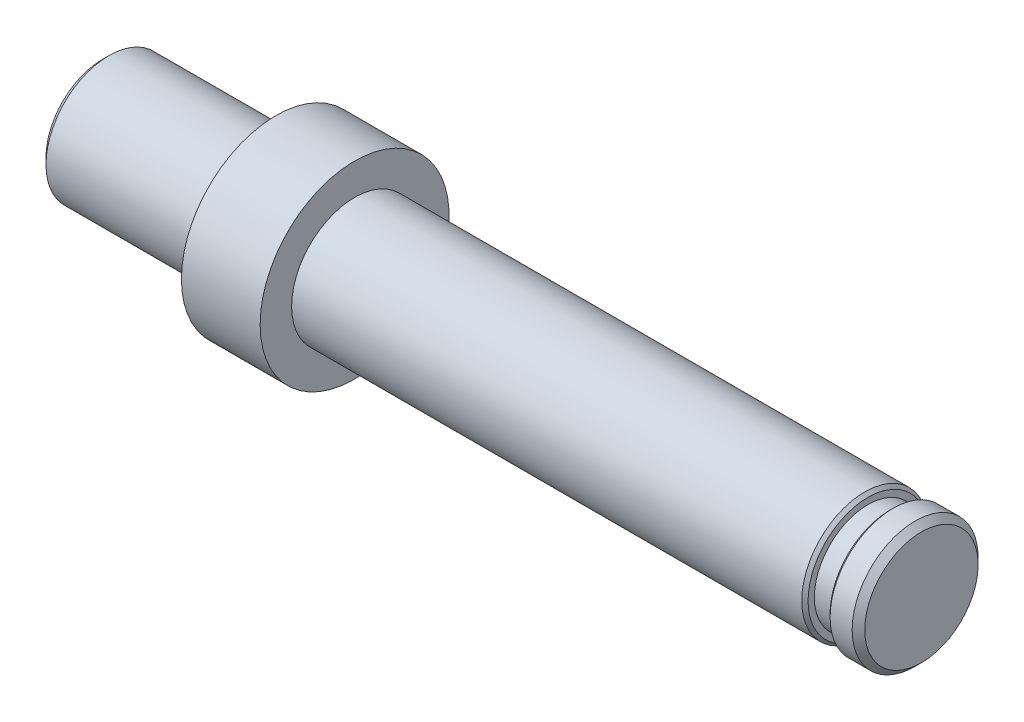
ISO-10303-21;
HEADER;
FILE_DESCRIPTION(('STEP AP214'),'2;1');
FILE_NAME('part.step','',(''),(''),'','','');
FILE_SCHEMA(('AUTOMOTIVE_DESIGN { 1 0 10303 214 1 1 1 1 }'));
ENDSEC;
DATA;
#1=APPLICATION_CONTEXT('core data for automotive mechanical design processes');
#2=APPLICATION_PROTOCOL_DEFINITION('international standard','automotive_design',2000,#1);
#3=PRODUCT_CONTEXT('',#1,'mechanical');
#4=PRODUCT('Part','Part','',(#3));
#5=PRODUCT_RELATED_PRODUCT_CATEGORY('part','',(#4));
#6=PRODUCT_DEFINITION_FORMATION('','',#4);
#7=PRODUCT_DEFINITION_CONTEXT('part definition',#1,'design');
#8=PRODUCT_DEFINITION('design','',#6,#7);
#9=PRODUCT_DEFINITION_SHAPE('','',#8);
#10=(LENGTH_UNIT() NAMED_UNIT(*) SI_UNIT(.MILLI.,.METRE.));
#11=(NAMED_UNIT(*) PLANE_ANGLE_UNIT() SI_UNIT($,.RADIAN.));
#12=(NAMED_UNIT(*) SI_UNIT($,.STERADIAN.) SOLID_ANGLE_UNIT());
#13=UNCERTAINTY_MEASURE_WITH_UNIT(LENGTH_MEASURE(1.E-05),#10,'distance_accuracy_value','');
#14=(GEOMETRIC_REPRESENTATION_CONTEXT(3) GLOBAL_UNCERTAINTY_ASSIGNED_CONTEXT((#13)) GLOBAL_UNIT_ASSIGNED_CONTEXT((#10,
#11,#12)) REPRESENTATION_CONTEXT('',''));
#15=CARTESIAN_POINT('',(0.,0.,0.));
#16=DIRECTION('',(0.,0.,1.));
#17=DIRECTION('',(1.,0.,0.));
#18=AXIS2_PLACEMENT_3D('',#15,#16,#17);
#19=CARTESIAN_POINT('',(0.,2.,0.));
#20=DIRECTION('',(1.,0.,0.));
#21=DIRECTION('',(0.,0.,-1.));
#22=AXIS2_PLACEMENT_3D('',#19,#20,#21);
#23=PLANE('',#22);
#24=CARTESIAN_POINT('',(0.,0.,0.));
#25=DIRECTION('',(1.,0.,0.));
#26=DIRECTION('',(0.,0.,-1.));
#27=AXIS2_PLACEMENT_3D('',#24,#25,#26);
#28=CIRCLE('',#27,1.8);
#29=CARTESIAN_POINT('',(0.,0.,-1.8));
#30=VERTEX_POINT('',#29);
#31=EDGE_CURVE('E69',#30,#30,#28,.F.);
#32=ORIENTED_EDGE('',*,*,#31,.T.);
#33=EDGE_LOOP('',(#32));
#34=FACE_BOUND('',#33,.T.);
#35=ADVANCED_FACE('F39',(#34),#23,.F.);
#36=CARTESIAN_POINT('',(26.,0.,0.));
#37=DIRECTION('',(-1.,0.,0.));
#38=DIRECTION('',(0.,0.,1.));
#39=AXIS2_PLACEMENT_3D('',#36,#37,#38);
#40=PLANE('',#39);
#41=CARTESIAN_POINT('',(26.,0.,0.));
#42=DIRECTION('',(-1.,0.,0.));
#43=DIRECTION('',(0.,0.,1.));
#44=AXIS2_PLACEMENT_3D('',#41,#42,#43);
#45=CIRCLE('',#44,1.8);
#46=CARTESIAN_POINT('',(26.,0.,1.8));
#47=VERTEX_POINT('',#46);
#48=EDGE_CURVE('E60',#47,#47,#45,.F.);
#49=ORIENTED_EDGE('',*,*,#48,.T.);
#50=EDGE_LOOP('',(#49));
#51=FACE_BOUND('',#50,.T.);
#52=ADVANCED_FACE('F121',(#51),#40,.F.);
#53=CARTESIAN_POINT('',(0.,0.,0.));
#54=DIRECTION('',(-1.,0.,0.));
#55=DIRECTION('',(0.,0.,1.));
#56=AXIS2_PLACEMENT_3D('',#53,#54,#55);
#57=CYLINDRICAL_SURFACE('',#56,2.);
#58=CARTESIAN_POINT('',(25.1,0.,0.));
#59=DIRECTION('',(1.,0.,0.));
#60=DIRECTION('',(0.,0.,-1.));
#61=AXIS2_PLACEMENT_3D('',#58,#59,#60);
#62=CIRCLE('',#61,2.);
#63=CARTESIAN_POINT('',(25.1,0.,-2.));
#64=VERTEX_POINT('',#63);
#65=EDGE_CURVE('E51',#64,#64,#62,.T.);
#66=ORIENTED_EDGE('',*,*,#65,.T.);
#67=EDGE_LOOP('',(#66));
#68=FACE_BOUND('',#67,.T.);
#69=CARTESIAN_POINT('',(25.8,0.,0.));
#70=DIRECTION('',(-1.,0.,0.));
#71=DIRECTION('',(0.,0.,1.));
#72=AXIS2_PLACEMENT_3D('',#69,#70,#71);
#73=CIRCLE('',#72,2.);
#74=CARTESIAN_POINT('',(25.8,0.,2.));
#75=VERTEX_POINT('',#74);
#76=EDGE_CURVE('E63',#75,#75,#73,.T.);
#77=ORIENTED_EDGE('',*,*,#76,.T.);
#78=EDGE_LOOP('',(#77));
#79=FACE_BOUND('',#78,.T.);
#80=ADVANCED_FACE('F127',(#68,#79),#57,.T.);
#81=CARTESIAN_POINT('',(25.,2.,0.));
#82=DIRECTION('',(1.,0.,0.));
#83=DIRECTION('',(0.,0.,-1.));
#84=AXIS2_PLACEMENT_3D('',#81,#82,#83);
#85=PLANE('',#84);
#86=CARTESIAN_POINT('',(25.,0.,0.));
#87=DIRECTION('',(1.,0.,0.));
#88=DIRECTION('',(0.,0.,-1.));
#89=AXIS2_PLACEMENT_3D('',#86,#87,#88);
#90=CIRCLE('',#89,1.9);
#91=CARTESIAN_POINT('',(25.,0.,-1.9));
#92=VERTEX_POINT('',#91);
#93=EDGE_CURVE('E55',#92,#92,#90,.F.);
#94=ORIENTED_EDGE('',*,*,#93,.T.);
#95=EDGE_LOOP('',(#94));
#96=FACE_BOUND('',#95,.T.);
#97=CARTESIAN_POINT('',(25.,0.,0.));
#98=DIRECTION('',(-1.,0.,0.));
#99=DIRECTION('',(0.,0.,1.));
#100=AXIS2_PLACEMENT_3D('',#97,#98,#99);
#101=CIRCLE('',#100,1.7);
#102=CARTESIAN_POINT('',(25.,0.,1.7));
#103=VERTEX_POINT('',#102);
#104=EDGE_CURVE('E72',#103,#103,#101,.T.);
#105=ORIENTED_EDGE('',*,*,#104,.F.);
#106=EDGE_LOOP('',(#105));
#107=FACE_BOUND('',#106,.T.);
#108=ADVANCED_FACE('F159',(#96,#107),#85,.F.);
#109=CARTESIAN_POINT('',(0.,0.,0.));
#110=DIRECTION('',(-1.,0.,0.));
#111=DIRECTION('',(0.,0.,1.));
#112=AXIS2_PLACEMENT_3D('',#109,#110,#111);
#113=CYLINDRICAL_SURFACE('',#112,1.7);
#114=CARTESIAN_POINT('',(24.3,0.,0.));
#115=DIRECTION('',(-1.,0.,0.));
#116=DIRECTION('',(0.,0.,1.));
#117=AXIS2_PLACEMENT_3D('',#114,#115,#116);
#118=CIRCLE('',#117,1.7);
#119=CARTESIAN_POINT('',(24.3,0.,1.7));
#120=VERTEX_POINT('',#119);
#121=EDGE_CURVE('E75',#120,#120,#118,.T.);
#122=ORIENTED_EDGE('',*,*,#121,.F.);
#123=EDGE_LOOP('',(#122));
#124=FACE_BOUND('',#123,.T.);
#125=ORIENTED_EDGE('',*,*,#104,.T.);
#126=EDGE_LOOP('',(#125));
#127=FACE_BOUND('',#126,.T.);
#128=ADVANCED_FACE('F118',(#124,#127),#113,.T.);
#129=CARTESIAN_POINT('',(24.3,1.7,0.));
#130=DIRECTION('',(-1.,0.,0.));
#131=DIRECTION('',(0.,0.,1.));
#132=AXIS2_PLACEMENT_3D('',#129,#130,#131);
#133=PLANE('',#132);
#134=CARTESIAN_POINT('',(24.3,0.,0.));
#135=DIRECTION('',(-1.,0.,0.));
#136=DIRECTION('',(0.,0.,1.));
#137=AXIS2_PLACEMENT_3D('',#134,#135,#136);
#138=CIRCLE('',#137,1.9);
#139=CARTESIAN_POINT('',(24.3,0.,1.9));
#140=VERTEX_POINT('',#139);
#141=EDGE_CURVE('E10',#140,#140,#138,.F.);
#142=ORIENTED_EDGE('',*,*,#141,.T.);
#143=EDGE_LOOP('',(#142));
#144=FACE_BOUND('',#143,.T.);
#145=ORIENTED_EDGE('',*,*,#121,.T.);
#146=EDGE_LOOP('',(#145));
#147=FACE_BOUND('',#146,.T.);
#148=ADVANCED_FACE('F113',(#144,#147),#133,.F.);
#149=CARTESIAN_POINT('',(0.,0.,0.));
#150=DIRECTION('',(-1.,0.,0.));
#151=DIRECTION('',(0.,0.,1.));
#152=AXIS2_PLACEMENT_3D('',#149,#150,#151);
#153=CYLINDRICAL_SURFACE('',#152,2.);
#154=CARTESIAN_POINT('',(24.2,0.,0.));
#155=DIRECTION('',(-1.,0.,0.));
#156=DIRECTION('',(0.,0.,1.));
#157=AXIS2_PLACEMENT_3D('',#154,#155,#156);
#158=CIRCLE('',#157,2.);
#159=CARTESIAN_POINT('',(24.2,0.,2.));
#160=VERTEX_POINT('',#159);
#161=EDGE_CURVE('E47',#160,#160,#158,.T.);
#162=ORIENTED_EDGE('',*,*,#161,.T.);
#163=EDGE_LOOP('',(#162));
#164=FACE_BOUND('',#163,.T.);
#165=CARTESIAN_POINT('',(8.,0.,0.));
#166=DIRECTION('',(-1.,0.,0.));
#167=DIRECTION('',(0.,0.,1.));
#168=AXIS2_PLACEMENT_3D('',#165,#166,#167);
#169=CIRCLE('',#168,2.);
#170=CARTESIAN_POINT('',(8.,0.,2.));
#171=VERTEX_POINT('',#170);
#172=EDGE_CURVE('E78',#171,#171,#169,.T.);
#173=ORIENTED_EDGE('',*,*,#172,.F.);
#174=EDGE_LOOP('',(#173));
#175=FACE_BOUND('',#174,.T.);
#176=ADVANCED_FACE('F108',(#164,#175),#153,.T.);
#177=CARTESIAN_POINT('',(8.,2.,0.));
#178=DIRECTION('',(-1.,0.,0.));
#179=DIRECTION('',(0.,0.,1.));
#180=AXIS2_PLACEMENT_3D('',#177,#178,#179);
#181=PLANE('',#180);
#182=CARTESIAN_POINT('',(8.,0.,0.));
#183=DIRECTION('',(-1.,0.,0.));
#184=DIRECTION('',(0.,0.,1.));
#185=AXIS2_PLACEMENT_3D('',#182,#183,#184);
#186=CIRCLE('',#185,3.);
#187=CARTESIAN_POINT('',(8.,0.,3.));
#188=VERTEX_POINT('',#187);
#189=EDGE_CURVE('E81',#188,#188,#186,.T.);
#190=ORIENTED_EDGE('',*,*,#189,.F.);
#191=EDGE_LOOP('',(#190));
#192=FACE_BOUND('',#191,.T.);
#193=ORIENTED_EDGE('',*,*,#172,.T.);
#194=EDGE_LOOP('',(#193));
#195=FACE_BOUND('',#194,.T.);
#196=ADVANCED_FACE('F102',(#192,#195),#181,.F.);
#197=CARTESIAN_POINT('',(0.,0.,0.));
#198=DIRECTION('',(-1.,0.,0.));
#199=DIRECTION('',(0.,0.,1.));
#200=AXIS2_PLACEMENT_3D('',#197,#198,#199);
#201=CYLINDRICAL_SURFACE('',#200,3.);
#202=CARTESIAN_POINT('',(5.5,0.,0.));
#203=DIRECTION('',(-1.,0.,0.));
#204=DIRECTION('',(0.,0.,1.));
#205=AXIS2_PLACEMENT_3D('',#202,#203,#204);
#206=CIRCLE('',#205,3.);
#207=CARTESIAN_POINT('',(5.5,0.,3.));
#208=VERTEX_POINT('',#207);
#209=EDGE_CURVE('E84',#208,#208,#206,.T.);
#210=ORIENTED_EDGE('',*,*,#209,.F.);
#211=EDGE_LOOP('',(#210));
#212=FACE_BOUND('',#211,.T.);
#213=ORIENTED_EDGE('',*,*,#189,.T.);
#214=EDGE_LOOP('',(#213));
#215=FACE_BOUND('',#214,.T.);
#216=ADVANCED_FACE('F96',(#212,#215),#201,.T.);
#217=CARTESIAN_POINT('',(5.5,3.,0.));
#218=DIRECTION('',(1.,0.,0.));
#219=DIRECTION('',(0.,0.,-1.));
#220=AXIS2_PLACEMENT_3D('',#217,#218,#219);
#221=PLANE('',#220);
#222=CARTESIAN_POINT('',(5.5,0.,0.));
#223=DIRECTION('',(-1.,0.,0.));
#224=DIRECTION('',(0.,0.,1.));
#225=AXIS2_PLACEMENT_3D('',#222,#223,#224);
#226=CIRCLE('',#225,2.);
#227=CARTESIAN_POINT('',(5.5,0.,2.));
#228=VERTEX_POINT('',#227);
#229=EDGE_CURVE('E87',#228,#228,#226,.T.);
#230=ORIENTED_EDGE('',*,*,#229,.F.);
#231=EDGE_LOOP('',(#230));
#232=FACE_BOUND('',#231,.T.);
#233=ORIENTED_EDGE('',*,*,#209,.T.);
#234=EDGE_LOOP('',(#233));
#235=FACE_BOUND('',#234,.T.);
#236=ADVANCED_FACE('F93',(#232,#235),#221,.F.);
#237=CARTESIAN_POINT('',(0.,0.,0.));
#238=DIRECTION('',(-1.,0.,0.));
#239=DIRECTION('',(0.,0.,1.));
#240=AXIS2_PLACEMENT_3D('',#237,#238,#239);
#241=CYLINDRICAL_SURFACE('',#240,2.);
#242=CARTESIAN_POINT('',(0.200000000000001,0.,0.));
#243=DIRECTION('',(1.,0.,0.));
#244=DIRECTION('',(0.,0.,-1.));
#245=AXIS2_PLACEMENT_3D('',#242,#243,#244);
#246=CIRCLE('',#245,2.);
#247=CARTESIAN_POINT('',(0.200000000000001,0.,-2.));
#248=VERTEX_POINT('',#247);
#249=EDGE_CURVE('E66',#248,#248,#246,.T.);
#250=ORIENTED_EDGE('',*,*,#249,.T.);
#251=EDGE_LOOP('',(#250));
#252=FACE_BOUND('',#251,.T.);
#253=ORIENTED_EDGE('',*,*,#229,.T.);
#254=EDGE_LOOP('',(#253));
#255=FACE_BOUND('',#254,.T.);
#256=ADVANCED_FACE('F91',(#252,#255),#241,.T.);
#257=CARTESIAN_POINT('',(0.,0.,0.));
#258=DIRECTION('',(1.,0.,0.));
#259=DIRECTION('',(0.,0.,-1.));
#260=AXIS2_PLACEMENT_3D('',#257,#258,#259);
#261=CONICAL_SURFACE('',#260,1.8,0.785398163397448);
#262=ORIENTED_EDGE('',*,*,#249,.F.);
#263=EDGE_LOOP('',(#262));
#264=FACE_BOUND('',#263,.T.);
#265=ORIENTED_EDGE('',*,*,#31,.F.);
#266=EDGE_LOOP('',(#265));
#267=FACE_BOUND('',#266,.T.);
#268=ADVANCED_FACE('F133',(#264,#267),#261,.T.);
#269=CARTESIAN_POINT('',(25.8,0.,0.));
#270=DIRECTION('',(-1.,0.,0.));
#271=DIRECTION('',(0.,0.,1.));
#272=AXIS2_PLACEMENT_3D('',#269,#270,#271);
#273=CONICAL_SURFACE('',#272,2.,0.785398163397444);
#274=ORIENTED_EDGE('',*,*,#48,.F.);
#275=EDGE_LOOP('',(#274));
#276=FACE_BOUND('',#275,.T.);
#277=ORIENTED_EDGE('',*,*,#76,.F.);
#278=EDGE_LOOP('',(#277));
#279=FACE_BOUND('',#278,.T.);
#280=ADVANCED_FACE('F139',(#276,#279),#273,.T.);
#281=CARTESIAN_POINT('',(25.,0.,0.));
#282=DIRECTION('',(1.,0.,0.));
#283=DIRECTION('',(0.,0.,-1.));
#284=AXIS2_PLACEMENT_3D('',#281,#282,#283);
#285=CONICAL_SURFACE('',#284,1.9,0.78539816339744);
#286=ORIENTED_EDGE('',*,*,#65,.F.);
#287=EDGE_LOOP('',(#286));
#288=FACE_BOUND('',#287,.T.);
#289=ORIENTED_EDGE('',*,*,#93,.F.);
#290=EDGE_LOOP('',(#289));
#291=FACE_BOUND('',#290,.T.);
#292=ADVANCED_FACE('F145',(#288,#291),#285,.T.);
#293=CARTESIAN_POINT('',(24.2,0.,0.));
#294=DIRECTION('',(-1.,0.,0.));
#295=DIRECTION('',(0.,0.,1.));
#296=AXIS2_PLACEMENT_3D('',#293,#294,#295);
#297=CONICAL_SURFACE('',#296,2.,0.785398163397461);
#298=ORIENTED_EDGE('',*,*,#141,.F.);
#299=EDGE_LOOP('',(#298));
#300=FACE_BOUND('',#299,.T.);
#301=ORIENTED_EDGE('',*,*,#161,.F.);
#302=EDGE_LOOP('',(#301));
#303=FACE_BOUND('',#302,.T.);
#304=ADVANCED_FACE('F42',(#300,#303),#297,.T.);
#305=CLOSED_SHELL('',(#35,#52,#80,#108,#128,#148,#176,#196,#216,#236,#256,#268,#280,#292,#304));
#306=MANIFOLD_SOLID_BREP('B2',#305);
#307=ADVANCED_BREP_SHAPE_REPRESENTATION('',(#18,#306),#14);
#308=SHAPE_DEFINITION_REPRESENTATION(#9,#307);
ENDSEC;
END-ISO-10303-21;
